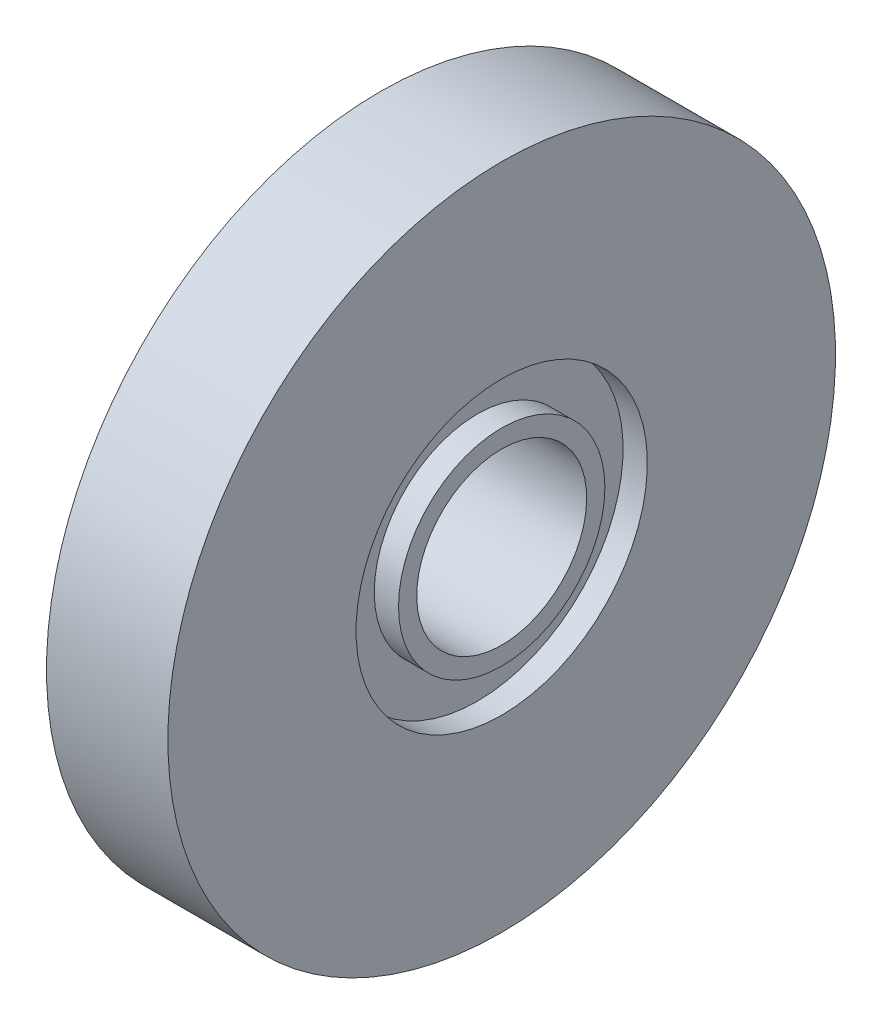
ISO-10303-21;
HEADER;
FILE_DESCRIPTION(('STEP AP214'),'2;1');
FILE_NAME('part.step','',(''),(''),'','','');
FILE_SCHEMA(('AUTOMOTIVE_DESIGN { 1 0 10303 214 1 1 1 1 }'));
ENDSEC;
DATA;
#1=APPLICATION_CONTEXT('core data for automotive mechanical design processes');
#2=APPLICATION_PROTOCOL_DEFINITION('international standard','automotive_design',2000,#1);
#3=PRODUCT_CONTEXT('',#1,'mechanical');
#4=PRODUCT('Part','Part','',(#3));
#5=PRODUCT_RELATED_PRODUCT_CATEGORY('part','',(#4));
#6=PRODUCT_DEFINITION_FORMATION('','',#4);
#7=PRODUCT_DEFINITION_CONTEXT('part definition',#1,'design');
#8=PRODUCT_DEFINITION('design','',#6,#7);
#9=PRODUCT_DEFINITION_SHAPE('','',#8);
#10=(LENGTH_UNIT() NAMED_UNIT(*) SI_UNIT(.MILLI.,.METRE.));
#11=(NAMED_UNIT(*) PLANE_ANGLE_UNIT() SI_UNIT($,.RADIAN.));
#12=(NAMED_UNIT(*) SI_UNIT($,.STERADIAN.) SOLID_ANGLE_UNIT());
#13=UNCERTAINTY_MEASURE_WITH_UNIT(LENGTH_MEASURE(1.E-05),#10,'distance_accuracy_value','');
#14=(GEOMETRIC_REPRESENTATION_CONTEXT(3) GLOBAL_UNCERTAINTY_ASSIGNED_CONTEXT((#13)) GLOBAL_UNIT_ASSIGNED_CONTEXT((#10,
#11,#12)) REPRESENTATION_CONTEXT('',''));
#15=CARTESIAN_POINT('',(0.,0.,0.));
#16=DIRECTION('',(0.,0.,1.));
#17=DIRECTION('',(1.,0.,0.));
#18=AXIS2_PLACEMENT_3D('',#15,#16,#17);
#19=CARTESIAN_POINT('',(-5.,8.5,0.));
#20=DIRECTION('',(-1.,0.,0.));
#21=DIRECTION('',(0.,-1.,0.));
#22=AXIS2_PLACEMENT_3D('',#19,#20,#21);
#23=PLANE('',#22);
#24=CARTESIAN_POINT('',(-5.,0.,0.));
#25=DIRECTION('',(1.,0.,0.));
#26=DIRECTION('',(0.,1.,0.));
#27=AXIS2_PLACEMENT_3D('',#24,#25,#26);
#28=CIRCLE('',#27,7.);
#29=CARTESIAN_POINT('',(-5.,7.,0.));
#30=VERTEX_POINT('',#29);
#31=EDGE_CURVE('E10',#30,#30,#28,.T.);
#32=ORIENTED_EDGE('',*,*,#31,.T.);
#33=EDGE_LOOP('',(#32));
#34=FACE_BOUND('',#33,.T.);
#35=CARTESIAN_POINT('',(-5.,0.,0.));
#36=DIRECTION('',(1.,0.,0.));
#37=DIRECTION('',(0.,1.,0.));
#38=AXIS2_PLACEMENT_3D('',#35,#36,#37);
#39=CIRCLE('',#38,8.5);
#40=CARTESIAN_POINT('',(-5.,8.5,0.));
#41=VERTEX_POINT('',#40);
#42=EDGE_CURVE('E71',#41,#41,#39,.T.);
#43=ORIENTED_EDGE('',*,*,#42,.F.);
#44=EDGE_LOOP('',(#43));
#45=FACE_BOUND('',#44,.T.);
#46=ADVANCED_FACE('F31',(#34,#45),#23,.T.);
#47=CARTESIAN_POINT('',(0.,0.,0.));
#48=DIRECTION('',(1.,0.,0.));
#49=DIRECTION('',(0.,1.,0.));
#50=AXIS2_PLACEMENT_3D('',#47,#48,#49);
#51=CYLINDRICAL_SURFACE('',#50,7.);
#52=CARTESIAN_POINT('',(5.,0.,0.));
#53=DIRECTION('',(1.,0.,0.));
#54=DIRECTION('',(0.,1.,0.));
#55=AXIS2_PLACEMENT_3D('',#52,#53,#54);
#56=CIRCLE('',#55,7.);
#57=CARTESIAN_POINT('',(5.,7.,0.));
#58=VERTEX_POINT('',#57);
#59=EDGE_CURVE('E37',#58,#58,#56,.T.);
#60=ORIENTED_EDGE('',*,*,#59,.T.);
#61=EDGE_LOOP('',(#60));
#62=FACE_BOUND('',#61,.T.);
#63=ORIENTED_EDGE('',*,*,#31,.F.);
#64=EDGE_LOOP('',(#63));
#65=FACE_BOUND('',#64,.T.);
#66=ADVANCED_FACE('F79',(#62,#65),#51,.F.);
#67=CARTESIAN_POINT('',(5.,7.,0.));
#68=DIRECTION('',(1.,0.,0.));
#69=DIRECTION('',(0.,1.,0.));
#70=AXIS2_PLACEMENT_3D('',#67,#68,#69);
#71=PLANE('',#70);
#72=CARTESIAN_POINT('',(5.,0.,0.));
#73=DIRECTION('',(1.,0.,0.));
#74=DIRECTION('',(0.,1.,0.));
#75=AXIS2_PLACEMENT_3D('',#72,#73,#74);
#76=CIRCLE('',#75,8.5);
#77=CARTESIAN_POINT('',(5.,8.5,0.));
#78=VERTEX_POINT('',#77);
#79=EDGE_CURVE('E41',#78,#78,#76,.T.);
#80=ORIENTED_EDGE('',*,*,#79,.T.);
#81=EDGE_LOOP('',(#80));
#82=FACE_BOUND('',#81,.T.);
#83=ORIENTED_EDGE('',*,*,#59,.F.);
#84=EDGE_LOOP('',(#83));
#85=FACE_BOUND('',#84,.T.);
#86=ADVANCED_FACE('F83',(#82,#85),#71,.T.);
#87=CARTESIAN_POINT('',(0.,0.,0.));
#88=DIRECTION('',(1.,0.,0.));
#89=DIRECTION('',(0.,1.,0.));
#90=AXIS2_PLACEMENT_3D('',#87,#88,#89);
#91=CYLINDRICAL_SURFACE('',#90,8.5);
#92=CARTESIAN_POINT('',(3.,0.,0.));
#93=DIRECTION('',(1.,0.,0.));
#94=DIRECTION('',(0.,1.,0.));
#95=AXIS2_PLACEMENT_3D('',#92,#93,#94);
#96=CIRCLE('',#95,8.5);
#97=CARTESIAN_POINT('',(3.,8.5,0.));
#98=VERTEX_POINT('',#97);
#99=EDGE_CURVE('E45',#98,#98,#96,.T.);
#100=ORIENTED_EDGE('',*,*,#99,.T.);
#101=EDGE_LOOP('',(#100));
#102=FACE_BOUND('',#101,.T.);
#103=ORIENTED_EDGE('',*,*,#79,.F.);
#104=EDGE_LOOP('',(#103));
#105=FACE_BOUND('',#104,.T.);
#106=ADVANCED_FACE('F87',(#102,#105),#91,.T.);
#107=CARTESIAN_POINT('',(3.,8.5,0.));
#108=DIRECTION('',(1.,0.,0.));
#109=DIRECTION('',(0.,1.,0.));
#110=AXIS2_PLACEMENT_3D('',#107,#108,#109);
#111=PLANE('',#110);
#112=CARTESIAN_POINT('',(3.,0.,0.));
#113=DIRECTION('',(1.,0.,0.));
#114=DIRECTION('',(0.,1.,0.));
#115=AXIS2_PLACEMENT_3D('',#112,#113,#114);
#116=CIRCLE('',#115,12.);
#117=CARTESIAN_POINT('',(3.,12.,0.));
#118=VERTEX_POINT('',#117);
#119=EDGE_CURVE('E50',#118,#118,#116,.T.);
#120=ORIENTED_EDGE('',*,*,#119,.T.);
#121=EDGE_LOOP('',(#120));
#122=FACE_BOUND('',#121,.T.);
#123=ORIENTED_EDGE('',*,*,#99,.F.);
#124=EDGE_LOOP('',(#123));
#125=FACE_BOUND('',#124,.T.);
#126=ADVANCED_FACE('F94',(#122,#125),#111,.T.);
#127=CARTESIAN_POINT('',(0.,0.,0.));
#128=DIRECTION('',(1.,0.,0.));
#129=DIRECTION('',(0.,1.,0.));
#130=AXIS2_PLACEMENT_3D('',#127,#128,#129);
#131=CYLINDRICAL_SURFACE('',#130,12.);
#132=CARTESIAN_POINT('',(5.,0.,0.));
#133=DIRECTION('',(1.,0.,0.));
#134=DIRECTION('',(0.,1.,0.));
#135=AXIS2_PLACEMENT_3D('',#132,#133,#134);
#136=CIRCLE('',#135,12.);
#137=CARTESIAN_POINT('',(5.,12.,0.));
#138=VERTEX_POINT('',#137);
#139=EDGE_CURVE('E53',#138,#138,#136,.T.);
#140=ORIENTED_EDGE('',*,*,#139,.T.);
#141=EDGE_LOOP('',(#140));
#142=FACE_BOUND('',#141,.T.);
#143=ORIENTED_EDGE('',*,*,#119,.F.);
#144=EDGE_LOOP('',(#143));
#145=FACE_BOUND('',#144,.T.);
#146=ADVANCED_FACE('F98',(#142,#145),#131,.F.);
#147=CARTESIAN_POINT('',(5.,12.,0.));
#148=DIRECTION('',(1.,0.,0.));
#149=DIRECTION('',(0.,1.,0.));
#150=AXIS2_PLACEMENT_3D('',#147,#148,#149);
#151=PLANE('',#150);
#152=CARTESIAN_POINT('',(5.,0.,0.));
#153=DIRECTION('',(1.,0.,0.));
#154=DIRECTION('',(0.,1.,0.));
#155=AXIS2_PLACEMENT_3D('',#152,#153,#154);
#156=CIRCLE('',#155,27.5);
#157=CARTESIAN_POINT('',(5.,27.5,0.));
#158=VERTEX_POINT('',#157);
#159=EDGE_CURVE('E56',#158,#158,#156,.T.);
#160=ORIENTED_EDGE('',*,*,#159,.T.);
#161=EDGE_LOOP('',(#160));
#162=FACE_BOUND('',#161,.T.);
#163=ORIENTED_EDGE('',*,*,#139,.F.);
#164=EDGE_LOOP('',(#163));
#165=FACE_BOUND('',#164,.T.);
#166=ADVANCED_FACE('F102',(#162,#165),#151,.T.);
#167=CARTESIAN_POINT('',(0.,0.,0.));
#168=DIRECTION('',(1.,0.,0.));
#169=DIRECTION('',(0.,1.,0.));
#170=AXIS2_PLACEMENT_3D('',#167,#168,#169);
#171=CYLINDRICAL_SURFACE('',#170,27.5);
#172=CARTESIAN_POINT('',(-5.,0.,0.));
#173=DIRECTION('',(1.,0.,0.));
#174=DIRECTION('',(0.,1.,0.));
#175=AXIS2_PLACEMENT_3D('',#172,#173,#174);
#176=CIRCLE('',#175,27.5);
#177=CARTESIAN_POINT('',(-5.,27.5,0.));
#178=VERTEX_POINT('',#177);
#179=EDGE_CURVE('E59',#178,#178,#176,.T.);
#180=ORIENTED_EDGE('',*,*,#179,.T.);
#181=EDGE_LOOP('',(#180));
#182=FACE_BOUND('',#181,.T.);
#183=ORIENTED_EDGE('',*,*,#159,.F.);
#184=EDGE_LOOP('',(#183));
#185=FACE_BOUND('',#184,.T.);
#186=ADVANCED_FACE('F106',(#182,#185),#171,.T.);
#187=CARTESIAN_POINT('',(-5.,27.5,0.));
#188=DIRECTION('',(-1.,0.,0.));
#189=DIRECTION('',(0.,-1.,0.));
#190=AXIS2_PLACEMENT_3D('',#187,#188,#189);
#191=PLANE('',#190);
#192=CARTESIAN_POINT('',(-5.,0.,0.));
#193=DIRECTION('',(1.,0.,0.));
#194=DIRECTION('',(0.,1.,0.));
#195=AXIS2_PLACEMENT_3D('',#192,#193,#194);
#196=CIRCLE('',#195,12.);
#197=CARTESIAN_POINT('',(-5.,12.,0.));
#198=VERTEX_POINT('',#197);
#199=EDGE_CURVE('E62',#198,#198,#196,.T.);
#200=ORIENTED_EDGE('',*,*,#199,.T.);
#201=EDGE_LOOP('',(#200));
#202=FACE_BOUND('',#201,.T.);
#203=ORIENTED_EDGE('',*,*,#179,.F.);
#204=EDGE_LOOP('',(#203));
#205=FACE_BOUND('',#204,.T.);
#206=ADVANCED_FACE('F110',(#202,#205),#191,.T.);
#207=CARTESIAN_POINT('',(0.,0.,0.));
#208=DIRECTION('',(1.,0.,0.));
#209=DIRECTION('',(0.,1.,0.));
#210=AXIS2_PLACEMENT_3D('',#207,#208,#209);
#211=CYLINDRICAL_SURFACE('',#210,12.);
#212=CARTESIAN_POINT('',(-3.,0.,0.));
#213=DIRECTION('',(1.,0.,0.));
#214=DIRECTION('',(0.,1.,0.));
#215=AXIS2_PLACEMENT_3D('',#212,#213,#214);
#216=CIRCLE('',#215,12.);
#217=CARTESIAN_POINT('',(-3.,12.,0.));
#218=VERTEX_POINT('',#217);
#219=EDGE_CURVE('E65',#218,#218,#216,.T.);
#220=ORIENTED_EDGE('',*,*,#219,.T.);
#221=EDGE_LOOP('',(#220));
#222=FACE_BOUND('',#221,.T.);
#223=ORIENTED_EDGE('',*,*,#199,.F.);
#224=EDGE_LOOP('',(#223));
#225=FACE_BOUND('',#224,.T.);
#226=ADVANCED_FACE('F114',(#222,#225),#211,.F.);
#227=CARTESIAN_POINT('',(-3.,8.5,0.));
#228=DIRECTION('',(-1.,0.,0.));
#229=DIRECTION('',(0.,-1.,0.));
#230=AXIS2_PLACEMENT_3D('',#227,#228,#229);
#231=PLANE('',#230);
#232=CARTESIAN_POINT('',(-3.,0.,0.));
#233=DIRECTION('',(1.,0.,0.));
#234=DIRECTION('',(0.,1.,0.));
#235=AXIS2_PLACEMENT_3D('',#232,#233,#234);
#236=CIRCLE('',#235,8.5);
#237=CARTESIAN_POINT('',(-3.,8.5,0.));
#238=VERTEX_POINT('',#237);
#239=EDGE_CURVE('E68',#238,#238,#236,.T.);
#240=ORIENTED_EDGE('',*,*,#239,.T.);
#241=EDGE_LOOP('',(#240));
#242=FACE_BOUND('',#241,.T.);
#243=ORIENTED_EDGE('',*,*,#219,.F.);
#244=EDGE_LOOP('',(#243));
#245=FACE_BOUND('',#244,.T.);
#246=ADVANCED_FACE('F118',(#242,#245),#231,.T.);
#247=CARTESIAN_POINT('',(0.,0.,0.));
#248=DIRECTION('',(1.,0.,0.));
#249=DIRECTION('',(0.,1.,0.));
#250=AXIS2_PLACEMENT_3D('',#247,#248,#249);
#251=CYLINDRICAL_SURFACE('',#250,8.5);
#252=ORIENTED_EDGE('',*,*,#42,.T.);
#253=EDGE_LOOP('',(#252));
#254=FACE_BOUND('',#253,.T.);
#255=ORIENTED_EDGE('',*,*,#239,.F.);
#256=EDGE_LOOP('',(#255));
#257=FACE_BOUND('',#256,.T.);
#258=ADVANCED_FACE('F75',(#254,#257),#251,.T.);
#259=CLOSED_SHELL('',(#46,#66,#86,#106,#126,#146,#166,#186,#206,#226,#246,#258));
#260=MANIFOLD_SOLID_BREP('B2',#259);
#261=ADVANCED_BREP_SHAPE_REPRESENTATION('',(#18,#260),#14);
#262=SHAPE_DEFINITION_REPRESENTATION(#9,#261);
ENDSEC;
END-ISO-10303-21;
